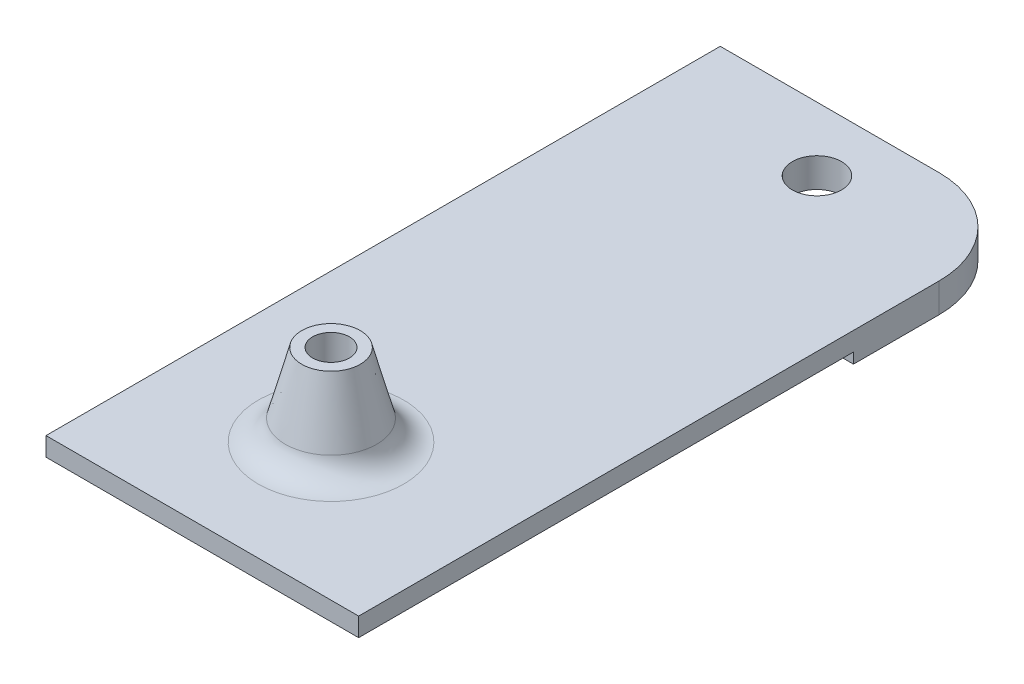
ISO-10303-21;
HEADER;
FILE_DESCRIPTION(('STEP AP214'),'2;1');
FILE_NAME('part.step','',(''),(''),'','','');
FILE_SCHEMA(('AUTOMOTIVE_DESIGN { 1 0 10303 214 1 1 1 1 }'));
ENDSEC;
DATA;
#1=APPLICATION_CONTEXT('core data for automotive mechanical design processes');
#2=APPLICATION_PROTOCOL_DEFINITION('international standard','automotive_design',2000,#1);
#3=PRODUCT_CONTEXT('',#1,'mechanical');
#4=PRODUCT('Part','Part','',(#3));
#5=PRODUCT_RELATED_PRODUCT_CATEGORY('part','',(#4));
#6=PRODUCT_DEFINITION_FORMATION('','',#4);
#7=PRODUCT_DEFINITION_CONTEXT('part definition',#1,'design');
#8=PRODUCT_DEFINITION('design','',#6,#7);
#9=PRODUCT_DEFINITION_SHAPE('','',#8);
#10=(LENGTH_UNIT() NAMED_UNIT(*) SI_UNIT(.MILLI.,.METRE.));
#11=(NAMED_UNIT(*) PLANE_ANGLE_UNIT() SI_UNIT($,.RADIAN.));
#12=(NAMED_UNIT(*) SI_UNIT($,.STERADIAN.) SOLID_ANGLE_UNIT());
#13=UNCERTAINTY_MEASURE_WITH_UNIT(LENGTH_MEASURE(1.E-05),#10,'distance_accuracy_value','');
#14=(GEOMETRIC_REPRESENTATION_CONTEXT(3) GLOBAL_UNCERTAINTY_ASSIGNED_CONTEXT((#13)) GLOBAL_UNIT_ASSIGNED_CONTEXT((#10,
#11,#12)) REPRESENTATION_CONTEXT('',''));
#15=CARTESIAN_POINT('',(0.,0.,0.));
#16=DIRECTION('',(0.,0.,1.));
#17=DIRECTION('',(1.,0.,0.));
#18=AXIS2_PLACEMENT_3D('',#15,#16,#17);
#19=CARTESIAN_POINT('',(0.,-3.175,0.));
#20=DIRECTION('',(0.,1.,0.));
#21=DIRECTION('',(0.,0.,1.));
#22=AXIS2_PLACEMENT_3D('',#19,#20,#21);
#23=PLANE('',#22);
#24=CARTESIAN_POINT('',(89.5476999999999,-3.175,-106.114051497006));
#25=DIRECTION('',(0.,1.,0.));
#26=DIRECTION('',(0.,0.,1.));
#27=AXIS2_PLACEMENT_3D('',#24,#25,#26);
#28=CIRCLE('',#27,2.667);
#29=CARTESIAN_POINT('',(89.5476999999999,-3.175,-103.447051497006));
#30=VERTEX_POINT('',#29);
#31=EDGE_CURVE('E161',#30,#30,#28,.F.);
#32=ORIENTED_EDGE('',*,*,#31,.F.);
#33=EDGE_LOOP('',(#32));
#34=FACE_BOUND('',#33,.T.);
#35=DIRECTION('',(0.,0.,1.));
#36=VECTOR('',#35,1.);
#37=CARTESIAN_POINT('',(72.1483392082635,-3.175,0.));
#38=LINE('',#37,#36);
#39=CARTESIAN_POINT('',(72.1483392082635,-3.175,-113.03));
#40=VERTEX_POINT('',#39);
#41=CARTESIAN_POINT('',(72.1483392082635,-3.175,-93.5770126055896));
#42=VERTEX_POINT('',#41);
#43=EDGE_CURVE('E136',#40,#42,#38,.T.);
#44=ORIENTED_EDGE('',*,*,#43,.F.);
#45=DIRECTION('',(1.,0.,0.));
#46=VECTOR('',#45,1.);
#47=CARTESIAN_POINT('',(0.,-3.175,-113.03));
#48=LINE('',#47,#46);
#49=CARTESIAN_POINT('',(95.885,-3.175,-113.03));
#50=VERTEX_POINT('',#49);
#51=EDGE_CURVE('E74',#40,#50,#48,.T.);
#52=ORIENTED_EDGE('',*,*,#51,.T.);
#53=CARTESIAN_POINT('',(95.885,-3.175,-102.87));
#54=DIRECTION('',(0.,1.,0.));
#55=DIRECTION('',(0.,0.,1.));
#56=AXIS2_PLACEMENT_3D('',#53,#54,#55);
#57=CIRCLE('',#56,10.16);
#58=CARTESIAN_POINT('',(106.045,-3.175,-102.87));
#59=VERTEX_POINT('',#58);
#60=EDGE_CURVE('E188',#50,#59,#57,.F.);
#61=ORIENTED_EDGE('',*,*,#60,.T.);
#62=DIRECTION('',(0.,0.,-1.));
#63=VECTOR('',#62,1.);
#64=CARTESIAN_POINT('',(106.045,-3.175,0.));
#65=LINE('',#64,#63);
#66=CARTESIAN_POINT('',(106.045,-3.175,-93.5770126055896));
#67=VERTEX_POINT('',#66);
#68=EDGE_CURVE('E158',#67,#59,#65,.T.);
#69=ORIENTED_EDGE('',*,*,#68,.F.);
#70=DIRECTION('',(1.,0.,0.));
#71=VECTOR('',#70,1.);
#72=CARTESIAN_POINT('',(122.405515665302,-3.175,-93.5770126055896));
#73=LINE('',#72,#71);
#74=EDGE_CURVE('E135',#42,#67,#73,.T.);
#75=ORIENTED_EDGE('',*,*,#74,.F.);
#76=EDGE_LOOP('',(#44,#52,#61,#69,#75));
#77=FACE_BOUND('',#76,.T.);
#78=ADVANCED_FACE('F49',(#34,#77),#23,.F.);
#79=CARTESIAN_POINT('',(0.,0.,0.));
#80=DIRECTION('',(0.,1.,0.));
#81=DIRECTION('',(0.,0.,1.));
#82=AXIS2_PLACEMENT_3D('',#79,#80,#81);
#83=PLANE('',#82);
#84=CARTESIAN_POINT('',(89.5476999999999,0.,-106.114051497006));
#85=DIRECTION('',(0.,1.,0.));
#86=DIRECTION('',(0.,0.,1.));
#87=AXIS2_PLACEMENT_3D('',#84,#85,#86);
#88=CIRCLE('',#87,2.667);
#89=CARTESIAN_POINT('',(89.5476999999999,0.,-103.447051497006));
#90=VERTEX_POINT('',#89);
#91=EDGE_CURVE('E162',#90,#90,#88,.F.);
#92=ORIENTED_EDGE('',*,*,#91,.T.);
#93=EDGE_LOOP('',(#92));
#94=FACE_BOUND('',#93,.T.);
#95=CARTESIAN_POINT('',(88.2114679804571,0.,-54.7665660688212));
#96=DIRECTION('',(0.,1.,0.));
#97=DIRECTION('',(0.,0.,1.));
#98=AXIS2_PLACEMENT_3D('',#95,#96,#97);
#99=CIRCLE('',#98,7.88871265935987);
#100=CARTESIAN_POINT('',(88.2114679804571,0.,-46.8778534094613));
#101=VERTEX_POINT('',#100);
#102=EDGE_CURVE('E199',#101,#101,#99,.F.);
#103=ORIENTED_EDGE('',*,*,#102,.T.);
#104=EDGE_LOOP('',(#103));
#105=FACE_BOUND('',#104,.T.);
#106=DIRECTION('',(1.,0.,0.));
#107=VECTOR('',#106,1.);
#108=CARTESIAN_POINT('',(0.,0.,-113.03));
#109=LINE('',#108,#107);
#110=CARTESIAN_POINT('',(72.1483392082635,0.,-113.03));
#111=VERTEX_POINT('',#110);
#112=CARTESIAN_POINT('',(95.885,0.,-113.03));
#113=VERTEX_POINT('',#112);
#114=EDGE_CURVE('E129',#111,#113,#109,.T.);
#115=ORIENTED_EDGE('',*,*,#114,.F.);
#116=DIRECTION('',(0.,0.,1.));
#117=VECTOR('',#116,1.);
#118=CARTESIAN_POINT('',(72.1483392082635,0.,0.));
#119=LINE('',#118,#117);
#120=CARTESIAN_POINT('',(72.1483392082635,0.,-39.9282475532911));
#121=VERTEX_POINT('',#120);
#122=EDGE_CURVE('E125',#111,#121,#119,.T.);
#123=ORIENTED_EDGE('',*,*,#122,.T.);
#124=DIRECTION('',(1.,0.,0.));
#125=VECTOR('',#124,1.);
#126=CARTESIAN_POINT('',(0.,0.,-39.9282475532911));
#127=LINE('',#126,#125);
#128=CARTESIAN_POINT('',(106.045,0.,-39.9282475532911));
#129=VERTEX_POINT('',#128);
#130=EDGE_CURVE('E109',#121,#129,#127,.T.);
#131=ORIENTED_EDGE('',*,*,#130,.T.);
#132=DIRECTION('',(0.,0.,-1.));
#133=VECTOR('',#132,1.);
#134=CARTESIAN_POINT('',(106.045,0.,0.));
#135=LINE('',#134,#133);
#136=CARTESIAN_POINT('',(106.045,0.,-102.87));
#137=VERTEX_POINT('',#136);
#138=EDGE_CURVE('E173',#129,#137,#135,.T.);
#139=ORIENTED_EDGE('',*,*,#138,.T.);
#140=CARTESIAN_POINT('',(95.885,0.,-102.87));
#141=DIRECTION('',(0.,1.,0.));
#142=DIRECTION('',(0.,0.,1.));
#143=AXIS2_PLACEMENT_3D('',#140,#141,#142);
#144=CIRCLE('',#143,10.16);
#145=EDGE_CURVE('E179',#137,#113,#144,.T.);
#146=ORIENTED_EDGE('',*,*,#145,.T.);
#147=EDGE_LOOP('',(#115,#123,#131,#139,#146));
#148=FACE_BOUND('',#147,.T.);
#149=ADVANCED_FACE('F127',(#94,#105,#148),#83,.T.);
#150=CARTESIAN_POINT('',(0.,-3.175,-113.03));
#151=DIRECTION('',(0.,0.,1.));
#152=DIRECTION('',(1.,0.,0.));
#153=AXIS2_PLACEMENT_3D('',#150,#151,#152);
#154=PLANE('',#153);
#155=DIRECTION('',(0.,-1.,0.));
#156=VECTOR('',#155,1.);
#157=CARTESIAN_POINT('',(72.1483392082635,-3.175,-113.03));
#158=LINE('',#157,#156);
#159=EDGE_CURVE('E134',#111,#40,#158,.T.);
#160=ORIENTED_EDGE('',*,*,#159,.F.);
#161=ORIENTED_EDGE('',*,*,#114,.T.);
#162=DIRECTION('',(0.,1.,0.));
#163=VECTOR('',#162,1.);
#164=CARTESIAN_POINT('',(95.885,-3.175,-113.03));
#165=LINE('',#164,#163);
#166=EDGE_CURVE('E181',#113,#50,#165,.F.);
#167=ORIENTED_EDGE('',*,*,#166,.T.);
#168=ORIENTED_EDGE('',*,*,#51,.F.);
#169=EDGE_LOOP('',(#160,#161,#167,#168));
#170=FACE_BOUND('',#169,.T.);
#171=ADVANCED_FACE('F228',(#170),#154,.F.);
#172=CARTESIAN_POINT('',(106.045,-3.175,0.));
#173=DIRECTION('',(1.,0.,0.));
#174=DIRECTION('',(0.,0.,-1.));
#175=AXIS2_PLACEMENT_3D('',#172,#173,#174);
#176=PLANE('',#175);
#177=ORIENTED_EDGE('',*,*,#138,.F.);
#178=DIRECTION('',(0.,-1.,0.));
#179=VECTOR('',#178,1.);
#180=CARTESIAN_POINT('',(106.045,-3.175,-39.9282475532911));
#181=LINE('',#180,#179);
#182=CARTESIAN_POINT('',(106.045,-2.032,-39.9282475532911));
#183=VERTEX_POINT('',#182);
#184=EDGE_CURVE('E111',#129,#183,#181,.T.);
#185=ORIENTED_EDGE('',*,*,#184,.T.);
#186=DIRECTION('',(0.,0.,-1.));
#187=VECTOR('',#186,1.);
#188=CARTESIAN_POINT('',(106.045,-2.032,0.));
#189=LINE('',#188,#187);
#190=CARTESIAN_POINT('',(106.045,-2.032,-93.5770126055896));
#191=VERTEX_POINT('',#190);
#192=EDGE_CURVE('E141',#183,#191,#189,.T.);
#193=ORIENTED_EDGE('',*,*,#192,.T.);
#194=DIRECTION('',(0.,1.,0.));
#195=VECTOR('',#194,1.);
#196=CARTESIAN_POINT('',(106.045,-3.175,-93.5770126055896));
#197=LINE('',#196,#195);
#198=EDGE_CURVE('E149',#67,#191,#197,.T.);
#199=ORIENTED_EDGE('',*,*,#198,.F.);
#200=ORIENTED_EDGE('',*,*,#68,.T.);
#201=DIRECTION('',(0.,1.,0.));
#202=VECTOR('',#201,1.);
#203=CARTESIAN_POINT('',(106.045,0.,-102.87));
#204=LINE('',#203,#202);
#205=EDGE_CURVE('E167',#59,#137,#204,.T.);
#206=ORIENTED_EDGE('',*,*,#205,.T.);
#207=EDGE_LOOP('',(#177,#185,#193,#199,#200,#206));
#208=FACE_BOUND('',#207,.T.);
#209=ADVANCED_FACE('F206',(#208),#176,.T.);
#210=CARTESIAN_POINT('',(122.405515665302,-2.032,-93.5770126055896));
#211=DIRECTION('',(0.,0.,-1.));
#212=DIRECTION('',(-1.,0.,0.));
#213=AXIS2_PLACEMENT_3D('',#210,#211,#212);
#214=PLANE('',#213);
#215=DIRECTION('',(0.,1.,0.));
#216=VECTOR('',#215,1.);
#217=CARTESIAN_POINT('',(72.1483392082635,-2.032,-93.5770126055896));
#218=LINE('',#217,#216);
#219=CARTESIAN_POINT('',(72.1483392082635,-2.032,-93.5770126055896));
#220=VERTEX_POINT('',#219);
#221=EDGE_CURVE('E118',#42,#220,#218,.T.);
#222=ORIENTED_EDGE('',*,*,#221,.F.);
#223=ORIENTED_EDGE('',*,*,#74,.T.);
#224=ORIENTED_EDGE('',*,*,#198,.T.);
#225=DIRECTION('',(1.,0.,0.));
#226=VECTOR('',#225,1.);
#227=CARTESIAN_POINT('',(122.405515665302,-2.032,-93.5770126055896));
#228=LINE('',#227,#226);
#229=EDGE_CURVE('E140',#220,#191,#228,.T.);
#230=ORIENTED_EDGE('',*,*,#229,.F.);
#231=EDGE_LOOP('',(#222,#223,#224,#230));
#232=FACE_BOUND('',#231,.T.);
#233=ADVANCED_FACE('F220',(#232),#214,.F.);
#234=CARTESIAN_POINT('',(0.,-2.032,0.));
#235=DIRECTION('',(0.,-1.,0.));
#236=DIRECTION('',(0.,0.,-1.));
#237=AXIS2_PLACEMENT_3D('',#234,#235,#236);
#238=PLANE('',#237);
#239=DIRECTION('',(-1.,0.,0.));
#240=VECTOR('',#239,1.);
#241=CARTESIAN_POINT('',(0.,-2.032,-39.9282475532911));
#242=LINE('',#241,#240);
#243=CARTESIAN_POINT('',(72.1483392082635,-2.032,-39.9282475532911));
#244=VERTEX_POINT('',#243);
#245=EDGE_CURVE('E56',#183,#244,#242,.T.);
#246=ORIENTED_EDGE('',*,*,#245,.T.);
#247=DIRECTION('',(0.,0.,-1.));
#248=VECTOR('',#247,1.);
#249=CARTESIAN_POINT('',(72.1483392082635,-2.032,0.));
#250=LINE('',#249,#248);
#251=EDGE_CURVE('E12',#244,#220,#250,.T.);
#252=ORIENTED_EDGE('',*,*,#251,.T.);
#253=ORIENTED_EDGE('',*,*,#229,.T.);
#254=ORIENTED_EDGE('',*,*,#192,.F.);
#255=EDGE_LOOP('',(#246,#252,#253,#254));
#256=FACE_BOUND('',#255,.T.);
#257=ADVANCED_FACE('F207',(#256),#238,.T.);
#258=CARTESIAN_POINT('',(89.5476999999999,-3.175,-106.114051497006));
#259=DIRECTION('',(0.,1.,0.));
#260=DIRECTION('',(0.,0.,1.));
#261=AXIS2_PLACEMENT_3D('',#258,#259,#260);
#262=CYLINDRICAL_SURFACE('',#261,2.667);
#263=ORIENTED_EDGE('',*,*,#31,.T.);
#264=EDGE_LOOP('',(#263));
#265=FACE_BOUND('',#264,.T.);
#266=ORIENTED_EDGE('',*,*,#91,.F.);
#267=EDGE_LOOP('',(#266));
#268=FACE_BOUND('',#267,.T.);
#269=ADVANCED_FACE('F251',(#265,#268),#262,.F.);
#270=CARTESIAN_POINT('',(95.885,-3.175,-102.87));
#271=DIRECTION('',(0.,-1.,0.));
#272=DIRECTION('',(0.,0.,-1.));
#273=AXIS2_PLACEMENT_3D('',#270,#271,#272);
#274=CYLINDRICAL_SURFACE('',#273,10.16);
#275=ORIENTED_EDGE('',*,*,#60,.F.);
#276=ORIENTED_EDGE('',*,*,#166,.F.);
#277=ORIENTED_EDGE('',*,*,#145,.F.);
#278=ORIENTED_EDGE('',*,*,#205,.F.);
#279=EDGE_LOOP('',(#275,#276,#277,#278));
#280=FACE_BOUND('',#279,.T.);
#281=ADVANCED_FACE('F222',(#280),#274,.T.);
#282=CARTESIAN_POINT('',(88.2114679804571,8.89,-54.7665660688212));
#283=DIRECTION('',(0.,-1.,0.));
#284=DIRECTION('',(0.,0.,-1.));
#285=AXIS2_PLACEMENT_3D('',#282,#283,#284);
#286=CYLINDRICAL_SURFACE('',#285,1.9939);
#287=CARTESIAN_POINT('',(88.2114679804571,8.89,-54.7665660688212));
#288=DIRECTION('',(0.,1.,0.));
#289=DIRECTION('',(0.,0.,1.));
#290=AXIS2_PLACEMENT_3D('',#287,#288,#289);
#291=CIRCLE('',#290,1.9939);
#292=CARTESIAN_POINT('',(88.2114679804571,8.89,-52.7726660688212));
#293=VERTEX_POINT('',#292);
#294=EDGE_CURVE('E153',#293,#293,#291,.T.);
#295=ORIENTED_EDGE('',*,*,#294,.T.);
#296=EDGE_LOOP('',(#295));
#297=FACE_BOUND('',#296,.T.);
#298=CARTESIAN_POINT('',(88.2114679804571,0.,-54.7665660688212));
#299=DIRECTION('',(0.,1.,0.));
#300=DIRECTION('',(0.,0.,1.));
#301=AXIS2_PLACEMENT_3D('',#298,#299,#300);
#302=CIRCLE('',#301,1.9939);
#303=CARTESIAN_POINT('',(88.2114679804571,0.,-52.7726660688212));
#304=VERTEX_POINT('',#303);
#305=EDGE_CURVE('E189',#304,#304,#302,.F.);
#306=ORIENTED_EDGE('',*,*,#305,.T.);
#307=EDGE_LOOP('',(#306));
#308=FACE_BOUND('',#307,.T.);
#309=ADVANCED_FACE('F246',(#297,#308),#286,.F.);
#310=CARTESIAN_POINT('',(88.2114679804571,0.,-54.7665660688212));
#311=DIRECTION('',(0.,-1.,0.));
#312=DIRECTION('',(0.,0.,1.));
#313=AXIS2_PLACEMENT_3D('',#310,#311,#312);
#314=CONICAL_SURFACE('',#313,5.5499,0.26179938779915);
#315=CARTESIAN_POINT('',(88.2114679804571,2.25911955052751,-54.7665660688212));
#316=DIRECTION('',(0.,1.,0.));
#317=DIRECTION('',(0.,0.,1.));
#318=AXIS2_PLACEMENT_3D('',#315,#316,#317);
#319=CIRCLE('',#318,4.94457074083079);
#320=CARTESIAN_POINT('',(88.2114679804571,2.25911955052751,-49.8219953279904));
#321=VERTEX_POINT('',#320);
#322=EDGE_CURVE('E193',#321,#321,#319,.T.);
#323=ORIENTED_EDGE('',*,*,#322,.T.);
#324=EDGE_LOOP('',(#323));
#325=FACE_BOUND('',#324,.T.);
#326=CARTESIAN_POINT('',(88.2114679804571,8.89,-54.7665660688212));
#327=DIRECTION('',(0.,1.,0.));
#328=DIRECTION('',(0.,0.,1.));
#329=AXIS2_PLACEMENT_3D('',#326,#327,#328);
#330=CIRCLE('',#329,3.16783167928732);
#331=CARTESIAN_POINT('',(88.2114679804571,8.89,-51.5987343895339));
#332=VERTEX_POINT('',#331);
#333=EDGE_CURVE('E160',#332,#332,#330,.T.);
#334=ORIENTED_EDGE('',*,*,#333,.F.);
#335=EDGE_LOOP('',(#334));
#336=FACE_BOUND('',#335,.T.);
#337=ADVANCED_FACE('F270',(#325,#336),#314,.T.);
#338=CARTESIAN_POINT('',(0.,8.89,0.));
#339=DIRECTION('',(0.,1.,0.));
#340=DIRECTION('',(0.,0.,1.));
#341=AXIS2_PLACEMENT_3D('',#338,#339,#340);
#342=PLANE('',#341);
#343=ORIENTED_EDGE('',*,*,#294,.F.);
#344=EDGE_LOOP('',(#343));
#345=FACE_BOUND('',#344,.T.);
#346=ORIENTED_EDGE('',*,*,#333,.T.);
#347=EDGE_LOOP('',(#346));
#348=FACE_BOUND('',#347,.T.);
#349=ADVANCED_FACE('F269',(#345,#348),#342,.T.);
#350=ORIENTED_EDGE('',*,*,#305,.F.);
#351=EDGE_LOOP('',(#350));
#352=FACE_BOUND('',#351,.T.);
#353=ADVANCED_FACE('F239',(#352),#83,.T.);
#354=CARTESIAN_POINT('',(88.2114679804571,3.048,-54.7665660688212));
#355=DIRECTION('',(0.,1.,0.));
#356=DIRECTION('',(0.,0.,1.));
#357=AXIS2_PLACEMENT_3D('',#354,#355,#356);
#358=TOROIDAL_SURFACE('',#357,7.88871265935987,3.048);
#359=ORIENTED_EDGE('',*,*,#102,.F.);
#360=EDGE_LOOP('',(#359));
#361=FACE_BOUND('',#360,.T.);
#362=ORIENTED_EDGE('',*,*,#322,.F.);
#363=EDGE_LOOP('',(#362));
#364=FACE_BOUND('',#363,.T.);
#365=ADVANCED_FACE('F55',(#361,#364),#358,.F.);
#366=CARTESIAN_POINT('',(72.1483392082635,-25.4,-121.326373839537));
#367=DIRECTION('',(-1.,0.,0.));
#368=DIRECTION('',(0.,0.,1.));
#369=AXIS2_PLACEMENT_3D('',#366,#367,#368);
#370=PLANE('',#369);
#371=ORIENTED_EDGE('',*,*,#159,.T.);
#372=ORIENTED_EDGE('',*,*,#43,.T.);
#373=ORIENTED_EDGE('',*,*,#221,.T.);
#374=ORIENTED_EDGE('',*,*,#251,.F.);
#375=DIRECTION('',(0.,1.,0.));
#376=VECTOR('',#375,1.);
#377=CARTESIAN_POINT('',(72.1483392082635,-25.4,-39.9282475532911));
#378=LINE('',#377,#376);
#379=EDGE_CURVE('E68',#244,#121,#378,.T.);
#380=ORIENTED_EDGE('',*,*,#379,.T.);
#381=ORIENTED_EDGE('',*,*,#122,.F.);
#382=EDGE_LOOP('',(#371,#372,#373,#374,#380,#381));
#383=FACE_BOUND('',#382,.T.);
#384=ADVANCED_FACE('F121',(#383),#370,.T.);
#385=CARTESIAN_POINT('',(72.1483392082635,-25.4,-39.9282475532911));
#386=DIRECTION('',(0.,0.,1.));
#387=DIRECTION('',(1.,0.,0.));
#388=AXIS2_PLACEMENT_3D('',#385,#386,#387);
#389=PLANE('',#388);
#390=ORIENTED_EDGE('',*,*,#379,.F.);
#391=ORIENTED_EDGE('',*,*,#245,.F.);
#392=ORIENTED_EDGE('',*,*,#184,.F.);
#393=ORIENTED_EDGE('',*,*,#130,.F.);
#394=EDGE_LOOP('',(#390,#391,#392,#393));
#395=FACE_BOUND('',#394,.T.);
#396=ADVANCED_FACE('F113',(#395),#389,.T.);
#397=CLOSED_SHELL('',(#78,#149,#171,#209,#233,#257,#269,#281,#309,#337,#349,#353,#365,#384,#396));
#398=MANIFOLD_SOLID_BREP('B2',#397);
#399=ADVANCED_BREP_SHAPE_REPRESENTATION('',(#18,#398),#14);
#400=SHAPE_DEFINITION_REPRESENTATION(#9,#399);
ENDSEC;
END-ISO-10303-21;
